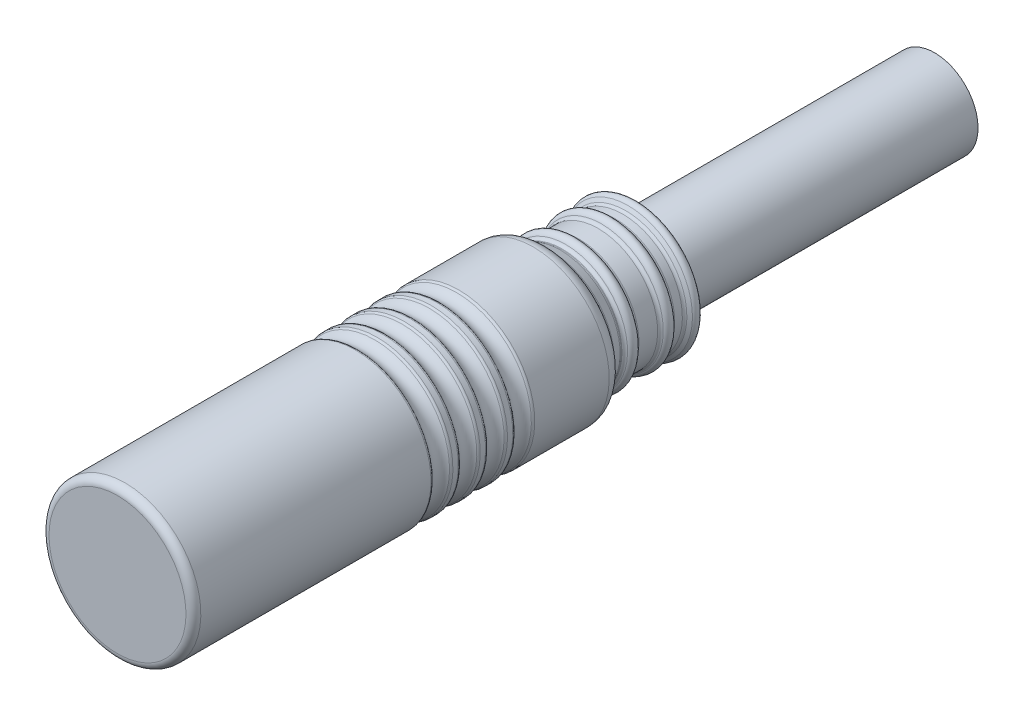
ISO-10303-21;
HEADER;
FILE_DESCRIPTION(('STEP AP214'),'2;1');
FILE_NAME('part.step','',(''),(''),'','','');
FILE_SCHEMA(('AUTOMOTIVE_DESIGN { 1 0 10303 214 1 1 1 1 }'));
ENDSEC;
DATA;
#1=APPLICATION_CONTEXT('core data for automotive mechanical design processes');
#2=APPLICATION_PROTOCOL_DEFINITION('international standard','automotive_design',2000,#1);
#3=PRODUCT_CONTEXT('',#1,'mechanical');
#4=PRODUCT('Part','Part','',(#3));
#5=PRODUCT_RELATED_PRODUCT_CATEGORY('part','',(#4));
#6=PRODUCT_DEFINITION_FORMATION('','',#4);
#7=PRODUCT_DEFINITION_CONTEXT('part definition',#1,'design');
#8=PRODUCT_DEFINITION('design','',#6,#7);
#9=PRODUCT_DEFINITION_SHAPE('','',#8);
#10=(LENGTH_UNIT() NAMED_UNIT(*) SI_UNIT(.MILLI.,.METRE.));
#11=(NAMED_UNIT(*) PLANE_ANGLE_UNIT() SI_UNIT($,.RADIAN.));
#12=(NAMED_UNIT(*) SI_UNIT($,.STERADIAN.) SOLID_ANGLE_UNIT());
#13=UNCERTAINTY_MEASURE_WITH_UNIT(LENGTH_MEASURE(1.E-05),#10,'distance_accuracy_value','');
#14=(GEOMETRIC_REPRESENTATION_CONTEXT(3) GLOBAL_UNCERTAINTY_ASSIGNED_CONTEXT((#13)) GLOBAL_UNIT_ASSIGNED_CONTEXT((#10,
#11,#12)) REPRESENTATION_CONTEXT('',''));
#15=CARTESIAN_POINT('',(0.,0.,0.));
#16=DIRECTION('',(0.,0.,1.));
#17=DIRECTION('',(1.,0.,0.));
#18=AXIS2_PLACEMENT_3D('',#15,#16,#17);
#19=CARTESIAN_POINT('',(0.,0.,-34.9));
#20=DIRECTION('',(0.,0.,-1.));
#21=DIRECTION('',(0.,1.,0.));
#22=AXIS2_PLACEMENT_3D('',#19,#20,#21);
#23=CYLINDRICAL_SURFACE('',#22,5.1);
#24=CARTESIAN_POINT('',(0.,0.,-17.7967873402005));
#25=DIRECTION('',(0.,0.,-1.));
#26=DIRECTION('',(0.,1.,0.));
#27=AXIS2_PLACEMENT_3D('',#24,#25,#26);
#28=CIRCLE('',#27,5.1);
#29=CARTESIAN_POINT('',(0.,5.1,-17.7967873402005));
#30=VERTEX_POINT('',#29);
#31=EDGE_CURVE('E149',#30,#30,#28,.T.);
#32=ORIENTED_EDGE('',*,*,#31,.F.);
#33=EDGE_LOOP('',(#32));
#34=FACE_BOUND('',#33,.T.);
#35=CARTESIAN_POINT('',(0.,0.,-17.4365459931328));
#36=DIRECTION('',(0.,0.,-1.));
#37=DIRECTION('',(0.,1.,0.));
#38=AXIS2_PLACEMENT_3D('',#35,#36,#37);
#39=CIRCLE('',#38,5.1);
#40=CARTESIAN_POINT('',(0.,5.1,-17.4365459931328));
#41=VERTEX_POINT('',#40);
#42=EDGE_CURVE('E40',#41,#41,#39,.T.);
#43=ORIENTED_EDGE('',*,*,#42,.T.);
#44=EDGE_LOOP('',(#43));
#45=FACE_BOUND('',#44,.T.);
#46=ADVANCED_FACE('F33',(#34,#45),#23,.T.);
#47=CARTESIAN_POINT('',(0.,0.,-17.4365459931328));
#48=DIRECTION('',(0.,0.,-1.));
#49=DIRECTION('',(0.,1.,0.));
#50=AXIS2_PLACEMENT_3D('',#47,#48,#49);
#51=TOROIDAL_SURFACE('',#50,4.89999999999996,0.199999999999999);
#52=CARTESIAN_POINT('',(0.,0.,-17.2814836787891));
#53=DIRECTION('',(0.,0.,-1.));
#54=DIRECTION('',(0.,1.,0.));
#55=AXIS2_PLACEMENT_3D('',#52,#53,#54);
#56=CIRCLE('',#55,5.02631578947364);
#57=CARTESIAN_POINT('',(0.,5.02631578947364,-17.2814836787891));
#58=VERTEX_POINT('',#57);
#59=EDGE_CURVE('E44',#58,#58,#56,.T.);
#60=ORIENTED_EDGE('',*,*,#59,.T.);
#61=EDGE_LOOP('',(#60));
#62=FACE_BOUND('',#61,.T.);
#63=ORIENTED_EDGE('',*,*,#42,.F.);
#64=EDGE_LOOP('',(#63));
#65=FACE_BOUND('',#64,.T.);
#66=ADVANCED_FACE('F35',(#62,#65),#51,.T.);
#67=CARTESIAN_POINT('',(0.,0.,-16.7));
#68=DIRECTION('',(0.,0.,-1.));
#69=DIRECTION('',(0.,1.,0.));
#70=AXIS2_PLACEMENT_3D('',#67,#68,#69);
#71=TOROIDAL_SURFACE('',#70,5.49999999999996,0.75);
#72=ORIENTED_EDGE('',*,*,#59,.F.);
#73=EDGE_LOOP('',(#72));
#74=FACE_BOUND('',#73,.T.);
#75=CARTESIAN_POINT('',(0.,0.,-16.1185163212109));
#76=DIRECTION('',(0.,0.,-1.));
#77=DIRECTION('',(0.,1.,0.));
#78=AXIS2_PLACEMENT_3D('',#75,#76,#77);
#79=CIRCLE('',#78,5.02631578947365);
#80=CARTESIAN_POINT('',(0.,5.02631578947364,-16.1185163212109));
#81=VERTEX_POINT('',#80);
#82=EDGE_CURVE('E48',#81,#81,#79,.T.);
#83=ORIENTED_EDGE('',*,*,#82,.T.);
#84=EDGE_LOOP('',(#83));
#85=FACE_BOUND('',#84,.T.);
#86=ADVANCED_FACE('F178',(#74,#85),#71,.F.);
#87=CARTESIAN_POINT('',(0.,0.,-15.9634540068672));
#88=DIRECTION('',(0.,0.,-1.));
#89=DIRECTION('',(0.,1.,0.));
#90=AXIS2_PLACEMENT_3D('',#87,#88,#89);
#91=TOROIDAL_SURFACE('',#90,4.89999999999996,0.199999999999999);
#92=CARTESIAN_POINT('',(0.,0.,-15.9634540068672));
#93=DIRECTION('',(0.,0.,-1.));
#94=DIRECTION('',(0.,1.,0.));
#95=AXIS2_PLACEMENT_3D('',#92,#93,#94);
#96=CIRCLE('',#95,5.1);
#97=CARTESIAN_POINT('',(0.,5.1,-15.9634540068672));
#98=VERTEX_POINT('',#97);
#99=EDGE_CURVE('E53',#98,#98,#96,.T.);
#100=ORIENTED_EDGE('',*,*,#99,.T.);
#101=EDGE_LOOP('',(#100));
#102=FACE_BOUND('',#101,.T.);
#103=ORIENTED_EDGE('',*,*,#82,.F.);
#104=EDGE_LOOP('',(#103));
#105=FACE_BOUND('',#104,.T.);
#106=ADVANCED_FACE('F185',(#102,#105),#91,.T.);
#107=ORIENTED_EDGE('',*,*,#99,.F.);
#108=EDGE_LOOP('',(#107));
#109=FACE_BOUND('',#108,.T.);
#110=CARTESIAN_POINT('',(0.,0.,-0.5));
#111=DIRECTION('',(0.,0.,-1.));
#112=DIRECTION('',(0.,1.,0.));
#113=AXIS2_PLACEMENT_3D('',#110,#111,#112);
#114=CIRCLE('',#113,5.1);
#115=CARTESIAN_POINT('',(0.,5.1,-0.500000000000001));
#116=VERTEX_POINT('',#115);
#117=EDGE_CURVE('E56',#116,#116,#114,.T.);
#118=ORIENTED_EDGE('',*,*,#117,.T.);
#119=EDGE_LOOP('',(#118));
#120=FACE_BOUND('',#119,.T.);
#121=ADVANCED_FACE('F173',(#109,#120),#23,.T.);
#122=CARTESIAN_POINT('',(0.,0.,-0.5));
#123=DIRECTION('',(0.,0.,-1.));
#124=DIRECTION('',(0.,1.,0.));
#125=AXIS2_PLACEMENT_3D('',#122,#123,#124);
#126=TOROIDAL_SURFACE('',#125,4.6,0.5);
#127=ORIENTED_EDGE('',*,*,#117,.F.);
#128=EDGE_LOOP('',(#127));
#129=FACE_BOUND('',#128,.T.);
#130=CARTESIAN_POINT('',(0.,0.,0.));
#131=DIRECTION('',(0.,0.,-1.));
#132=DIRECTION('',(0.,1.,0.));
#133=AXIS2_PLACEMENT_3D('',#130,#131,#132);
#134=CIRCLE('',#133,4.6);
#135=CARTESIAN_POINT('',(0.,4.6,0.));
#136=VERTEX_POINT('',#135);
#137=EDGE_CURVE('E59',#136,#136,#134,.T.);
#138=ORIENTED_EDGE('',*,*,#137,.T.);
#139=EDGE_LOOP('',(#138));
#140=FACE_BOUND('',#139,.T.);
#141=ADVANCED_FACE('F184',(#129,#140),#126,.T.);
#142=CARTESIAN_POINT('',(0.,0.,0.));
#143=DIRECTION('',(0.,0.,-1.));
#144=DIRECTION('',(0.,1.,0.));
#145=AXIS2_PLACEMENT_3D('',#142,#143,#144);
#146=PLANE('',#145);
#147=ORIENTED_EDGE('',*,*,#137,.F.);
#148=EDGE_LOOP('',(#147));
#149=FACE_BOUND('',#148,.T.);
#150=ADVANCED_FACE('F306',(#149),#146,.F.);
#151=CARTESIAN_POINT('',(0.,0.,-34.9));
#152=DIRECTION('',(0.,0.,1.));
#153=DIRECTION('',(0.,-1.,0.));
#154=AXIS2_PLACEMENT_3D('',#151,#152,#153);
#155=PLANE('',#154);
#156=CARTESIAN_POINT('',(0.,0.,-34.9));
#157=DIRECTION('',(0.,0.,1.));
#158=DIRECTION('',(0.,-1.,0.));
#159=AXIS2_PLACEMENT_3D('',#156,#157,#158);
#160=CIRCLE('',#159,2.92);
#161=CARTESIAN_POINT('',(0.,-2.92,-34.9));
#162=VERTEX_POINT('',#161);
#163=EDGE_CURVE('E10',#162,#162,#160,.F.);
#164=ORIENTED_EDGE('',*,*,#163,.F.);
#165=EDGE_LOOP('',(#164));
#166=FACE_BOUND('',#165,.T.);
#167=CARTESIAN_POINT('',(0.,0.,-34.9));
#168=DIRECTION('',(0.,0.,-1.));
#169=DIRECTION('',(0.,1.,0.));
#170=AXIS2_PLACEMENT_3D('',#167,#168,#169);
#171=CIRCLE('',#170,4.125);
#172=CARTESIAN_POINT('',(0.,4.125,-34.9));
#173=VERTEX_POINT('',#172);
#174=EDGE_CURVE('E62',#173,#173,#171,.T.);
#175=ORIENTED_EDGE('',*,*,#174,.T.);
#176=EDGE_LOOP('',(#175));
#177=FACE_BOUND('',#176,.T.);
#178=ADVANCED_FACE('F302',(#166,#177),#155,.F.);
#179=CARTESIAN_POINT('',(0.,0.,-34.575));
#180=DIRECTION('',(0.,0.,-1.));
#181=DIRECTION('',(0.,1.,0.));
#182=AXIS2_PLACEMENT_3D('',#179,#180,#181);
#183=TOROIDAL_SURFACE('',#182,4.125,0.325000000000005);
#184=ORIENTED_EDGE('',*,*,#174,.F.);
#185=EDGE_LOOP('',(#184));
#186=FACE_BOUND('',#185,.T.);
#187=CARTESIAN_POINT('',(0.,0.,-34.3129963528466));
#188=DIRECTION('',(0.,0.,-1.));
#189=DIRECTION('',(0.,1.,0.));
#190=AXIS2_PLACEMENT_3D('',#187,#188,#189);
#191=CIRCLE('',#190,4.31729947706198);
#192=CARTESIAN_POINT('',(0.,4.31729947706198,-34.3129963528466));
#193=VERTEX_POINT('',#192);
#194=EDGE_CURVE('E65',#193,#193,#191,.T.);
#195=ORIENTED_EDGE('',*,*,#194,.T.);
#196=EDGE_LOOP('',(#195));
#197=FACE_BOUND('',#196,.T.);
#198=ADVANCED_FACE('F298',(#186,#197),#183,.T.);
#199=CARTESIAN_POINT('',(0.,0.,-34.1550324936464));
#200=DIRECTION('',(0.,0.,-1.));
#201=DIRECTION('',(0.,1.,0.));
#202=AXIS2_PLACEMENT_3D('',#199,#200,#201);
#203=CONICAL_SURFACE('',#202,4.10207732533694,0.937641884585329);
#204=ORIENTED_EDGE('',*,*,#194,.F.);
#205=EDGE_LOOP('',(#204));
#206=FACE_BOUND('',#205,.T.);
#207=CARTESIAN_POINT('',(0.,0.,-34.1550324936464));
#208=DIRECTION('',(0.,0.,-1.));
#209=DIRECTION('',(0.,1.,0.));
#210=AXIS2_PLACEMENT_3D('',#207,#208,#209);
#211=CIRCLE('',#210,4.10207732533694);
#212=CARTESIAN_POINT('',(0.,4.10207732533694,-34.1550324936464));
#213=VERTEX_POINT('',#212);
#214=EDGE_CURVE('E68',#213,#213,#211,.T.);
#215=ORIENTED_EDGE('',*,*,#214,.T.);
#216=EDGE_LOOP('',(#215));
#217=FACE_BOUND('',#216,.T.);
#218=ADVANCED_FACE('F294',(#206,#217),#203,.T.);
#219=CARTESIAN_POINT('',(0.,0.,-33.9534912266053));
#220=DIRECTION('',(0.,0.,-1.));
#221=DIRECTION('',(0.,1.,0.));
#222=AXIS2_PLACEMENT_3D('',#219,#220,#221);
#223=TOROIDAL_SURFACE('',#222,4.25,0.250000000000006);
#224=ORIENTED_EDGE('',*,*,#214,.F.);
#225=EDGE_LOOP('',(#224));
#226=FACE_BOUND('',#225,.T.);
#227=CARTESIAN_POINT('',(0.,0.,-33.9534912266053));
#228=DIRECTION('',(0.,0.,-1.));
#229=DIRECTION('',(0.,1.,0.));
#230=AXIS2_PLACEMENT_3D('',#227,#228,#229);
#231=CIRCLE('',#230,4.);
#232=CARTESIAN_POINT('',(0.,4.,-33.9534912266053));
#233=VERTEX_POINT('',#232);
#234=EDGE_CURVE('E71',#233,#233,#231,.T.);
#235=ORIENTED_EDGE('',*,*,#234,.T.);
#236=EDGE_LOOP('',(#235));
#237=FACE_BOUND('',#236,.T.);
#238=ADVANCED_FACE('F290',(#226,#237),#223,.F.);
#239=CARTESIAN_POINT('',(0.,0.,-34.9));
#240=DIRECTION('',(0.,0.,-1.));
#241=DIRECTION('',(0.,1.,0.));
#242=AXIS2_PLACEMENT_3D('',#239,#240,#241);
#243=CYLINDRICAL_SURFACE('',#242,4.);
#244=ORIENTED_EDGE('',*,*,#234,.F.);
#245=EDGE_LOOP('',(#244));
#246=FACE_BOUND('',#245,.T.);
#247=CARTESIAN_POINT('',(0.,0.,-33.4379769299761));
#248=DIRECTION('',(0.,0.,-1.));
#249=DIRECTION('',(0.,1.,0.));
#250=AXIS2_PLACEMENT_3D('',#247,#248,#249);
#251=CIRCLE('',#250,4.);
#252=CARTESIAN_POINT('',(0.,4.,-33.4379769299761));
#253=VERTEX_POINT('',#252);
#254=EDGE_CURVE('E74',#253,#253,#251,.T.);
#255=ORIENTED_EDGE('',*,*,#254,.T.);
#256=EDGE_LOOP('',(#255));
#257=FACE_BOUND('',#256,.T.);
#258=ADVANCED_FACE('F286',(#246,#257),#243,.T.);
#259=CARTESIAN_POINT('',(0.,0.,-33.4379769299761));
#260=DIRECTION('',(0.,0.,-1.));
#261=DIRECTION('',(0.,1.,0.));
#262=AXIS2_PLACEMENT_3D('',#259,#260,#261);
#263=TOROIDAL_SURFACE('',#262,4.25,0.250000000000002);
#264=ORIENTED_EDGE('',*,*,#254,.F.);
#265=EDGE_LOOP('',(#264));
#266=FACE_BOUND('',#265,.T.);
#267=CARTESIAN_POINT('',(0.,0.,-33.2088481452283));
#268=DIRECTION('',(0.,0.,-1.));
#269=DIRECTION('',(0.,1.,0.));
#270=AXIS2_PLACEMENT_3D('',#267,#268,#269);
#271=CIRCLE('',#270,4.15);
#272=CARTESIAN_POINT('',(0.,4.15,-33.2088481452283));
#273=VERTEX_POINT('',#272);
#274=EDGE_CURVE('E77',#273,#273,#271,.T.);
#275=ORIENTED_EDGE('',*,*,#274,.T.);
#276=EDGE_LOOP('',(#275));
#277=FACE_BOUND('',#276,.T.);
#278=ADVANCED_FACE('F282',(#266,#277),#263,.F.);
#279=CARTESIAN_POINT('',(0.,0.,-32.8651549681066));
#280=DIRECTION('',(0.,0.,-1.));
#281=DIRECTION('',(0.,1.,0.));
#282=AXIS2_PLACEMENT_3D('',#279,#280,#281);
#283=TOROIDAL_SURFACE('',#282,4.,0.375);
#284=CARTESIAN_POINT('',(0.,0.,-32.5214617909849));
#285=DIRECTION('',(0.,0.,-1.));
#286=DIRECTION('',(0.,1.,0.));
#287=AXIS2_PLACEMENT_3D('',#284,#285,#286);
#288=CIRCLE('',#287,4.15);
#289=CARTESIAN_POINT('',(0.,4.15,-32.5214617909849));
#290=VERTEX_POINT('',#289);
#291=EDGE_CURVE('E80',#290,#290,#288,.T.);
#292=ORIENTED_EDGE('',*,*,#291,.T.);
#293=EDGE_LOOP('',(#292));
#294=FACE_BOUND('',#293,.T.);
#295=ORIENTED_EDGE('',*,*,#274,.F.);
#296=EDGE_LOOP('',(#295));
#297=FACE_BOUND('',#296,.T.);
#298=ADVANCED_FACE('F278',(#294,#297),#283,.T.);
#299=CARTESIAN_POINT('',(0.,0.,-32.2923330062371));
#300=DIRECTION('',(0.,0.,-1.));
#301=DIRECTION('',(0.,1.,0.));
#302=AXIS2_PLACEMENT_3D('',#299,#300,#301);
#303=TOROIDAL_SURFACE('',#302,4.25,0.249999999999999);
#304=CARTESIAN_POINT('',(0.,0.,-32.2923330062371));
#305=DIRECTION('',(0.,0.,-1.));
#306=DIRECTION('',(0.,1.,0.));
#307=AXIS2_PLACEMENT_3D('',#304,#305,#306);
#308=CIRCLE('',#307,4.);
#309=CARTESIAN_POINT('',(0.,4.,-32.2923330062371));
#310=VERTEX_POINT('',#309);
#311=EDGE_CURVE('E83',#310,#310,#308,.T.);
#312=ORIENTED_EDGE('',*,*,#311,.T.);
#313=EDGE_LOOP('',(#312));
#314=FACE_BOUND('',#313,.T.);
#315=ORIENTED_EDGE('',*,*,#291,.F.);
#316=EDGE_LOOP('',(#315));
#317=FACE_BOUND('',#316,.T.);
#318=ADVANCED_FACE('F274',(#314,#317),#303,.F.);
#319=CARTESIAN_POINT('',(0.,0.,-34.9));
#320=DIRECTION('',(0.,0.,-1.));
#321=DIRECTION('',(0.,1.,0.));
#322=AXIS2_PLACEMENT_3D('',#319,#320,#321);
#323=CYLINDRICAL_SURFACE('',#322,4.);
#324=ORIENTED_EDGE('',*,*,#311,.F.);
#325=EDGE_LOOP('',(#324));
#326=FACE_BOUND('',#325,.T.);
#327=CARTESIAN_POINT('',(0.,0.,-31.0379769299761));
#328=DIRECTION('',(0.,0.,-1.));
#329=DIRECTION('',(0.,1.,0.));
#330=AXIS2_PLACEMENT_3D('',#327,#328,#329);
#331=CIRCLE('',#330,4.);
#332=CARTESIAN_POINT('',(0.,4.,-31.0379769299761));
#333=VERTEX_POINT('',#332);
#334=EDGE_CURVE('E86',#333,#333,#331,.T.);
#335=ORIENTED_EDGE('',*,*,#334,.T.);
#336=EDGE_LOOP('',(#335));
#337=FACE_BOUND('',#336,.T.);
#338=ADVANCED_FACE('F270',(#326,#337),#323,.T.);
#339=CARTESIAN_POINT('',(0.,0.,-31.0379769299761));
#340=DIRECTION('',(0.,0.,-1.));
#341=DIRECTION('',(0.,1.,0.));
#342=AXIS2_PLACEMENT_3D('',#339,#340,#341);
#343=TOROIDAL_SURFACE('',#342,4.25,0.250000000000002);
#344=ORIENTED_EDGE('',*,*,#334,.F.);
#345=EDGE_LOOP('',(#344));
#346=FACE_BOUND('',#345,.T.);
#347=CARTESIAN_POINT('',(0.,0.,-30.8088481452283));
#348=DIRECTION('',(0.,0.,-1.));
#349=DIRECTION('',(0.,1.,0.));
#350=AXIS2_PLACEMENT_3D('',#347,#348,#349);
#351=CIRCLE('',#350,4.15);
#352=CARTESIAN_POINT('',(0.,4.15,-30.8088481452283));
#353=VERTEX_POINT('',#352);
#354=EDGE_CURVE('E89',#353,#353,#351,.T.);
#355=ORIENTED_EDGE('',*,*,#354,.T.);
#356=EDGE_LOOP('',(#355));
#357=FACE_BOUND('',#356,.T.);
#358=ADVANCED_FACE('F266',(#346,#357),#343,.F.);
#359=CARTESIAN_POINT('',(0.,0.,-30.4651549681066));
#360=DIRECTION('',(0.,0.,-1.));
#361=DIRECTION('',(0.,1.,0.));
#362=AXIS2_PLACEMENT_3D('',#359,#360,#361);
#363=TOROIDAL_SURFACE('',#362,4.,0.375);
#364=CARTESIAN_POINT('',(0.,0.,-30.1214617909849));
#365=DIRECTION('',(0.,0.,-1.));
#366=DIRECTION('',(0.,1.,0.));
#367=AXIS2_PLACEMENT_3D('',#364,#365,#366);
#368=CIRCLE('',#367,4.15);
#369=CARTESIAN_POINT('',(0.,4.15,-30.1214617909849));
#370=VERTEX_POINT('',#369);
#371=EDGE_CURVE('E92',#370,#370,#368,.T.);
#372=ORIENTED_EDGE('',*,*,#371,.T.);
#373=EDGE_LOOP('',(#372));
#374=FACE_BOUND('',#373,.T.);
#375=ORIENTED_EDGE('',*,*,#354,.F.);
#376=EDGE_LOOP('',(#375));
#377=FACE_BOUND('',#376,.T.);
#378=ADVANCED_FACE('F262',(#374,#377),#363,.T.);
#379=CARTESIAN_POINT('',(0.,0.,-29.8923330062371));
#380=DIRECTION('',(0.,0.,-1.));
#381=DIRECTION('',(0.,1.,0.));
#382=AXIS2_PLACEMENT_3D('',#379,#380,#381);
#383=TOROIDAL_SURFACE('',#382,4.25,0.249999999999999);
#384=CARTESIAN_POINT('',(0.,0.,-29.8923330062371));
#385=DIRECTION('',(0.,0.,-1.));
#386=DIRECTION('',(0.,1.,0.));
#387=AXIS2_PLACEMENT_3D('',#384,#385,#386);
#388=CIRCLE('',#387,4.);
#389=CARTESIAN_POINT('',(0.,4.,-29.8923330062371));
#390=VERTEX_POINT('',#389);
#391=EDGE_CURVE('E95',#390,#390,#388,.T.);
#392=ORIENTED_EDGE('',*,*,#391,.T.);
#393=EDGE_LOOP('',(#392));
#394=FACE_BOUND('',#393,.T.);
#395=ORIENTED_EDGE('',*,*,#371,.F.);
#396=EDGE_LOOP('',(#395));
#397=FACE_BOUND('',#396,.T.);
#398=ADVANCED_FACE('F258',(#394,#397),#383,.F.);
#399=CARTESIAN_POINT('',(0.,0.,-34.9));
#400=DIRECTION('',(0.,0.,-1.));
#401=DIRECTION('',(0.,1.,0.));
#402=AXIS2_PLACEMENT_3D('',#399,#400,#401);
#403=CYLINDRICAL_SURFACE('',#402,4.);
#404=ORIENTED_EDGE('',*,*,#391,.F.);
#405=EDGE_LOOP('',(#404));
#406=FACE_BOUND('',#405,.T.);
#407=CARTESIAN_POINT('',(0.,0.,-29.8423330062371));
#408=DIRECTION('',(0.,0.,-1.));
#409=DIRECTION('',(0.,1.,0.));
#410=AXIS2_PLACEMENT_3D('',#407,#408,#409);
#411=CIRCLE('',#410,4.);
#412=CARTESIAN_POINT('',(0.,4.,-29.8423330062371));
#413=VERTEX_POINT('',#412);
#414=EDGE_CURVE('E98',#413,#413,#411,.T.);
#415=ORIENTED_EDGE('',*,*,#414,.T.);
#416=EDGE_LOOP('',(#415));
#417=FACE_BOUND('',#416,.T.);
#418=ADVANCED_FACE('F254',(#406,#417),#403,.T.);
#419=CARTESIAN_POINT('',(0.,0.,-29.8423330062371));
#420=DIRECTION('',(0.,0.,-1.));
#421=DIRECTION('',(0.,1.,0.));
#422=AXIS2_PLACEMENT_3D('',#419,#420,#421);
#423=TOROIDAL_SURFACE('',#422,4.25,0.25);
#424=ORIENTED_EDGE('',*,*,#414,.F.);
#425=EDGE_LOOP('',(#424));
#426=FACE_BOUND('',#425,.T.);
#427=CARTESIAN_POINT('',(0.,0.,-29.7532210301054));
#428=DIRECTION('',(0.,0.,-1.));
#429=DIRECTION('',(0.,1.,0.));
#430=AXIS2_PLACEMENT_3D('',#427,#428,#429);
#431=CIRCLE('',#430,4.01642120021307);
#432=CARTESIAN_POINT('',(0.,4.01642120021306,-29.7532210301054));
#433=VERTEX_POINT('',#432);
#434=EDGE_CURVE('E101',#433,#433,#431,.T.);
#435=ORIENTED_EDGE('',*,*,#434,.T.);
#436=EDGE_LOOP('',(#435));
#437=FACE_BOUND('',#436,.T.);
#438=ADVANCED_FACE('F250',(#426,#437),#423,.F.);
#439=CARTESIAN_POINT('',(0.,0.,-29.1409682434623));
#440=DIRECTION('',(0.,0.,1.));
#441=DIRECTION('',(0.,-1.,0.));
#442=AXIS2_PLACEMENT_3D('',#439,#440,#441);
#443=CONICAL_SURFACE('',#442,4.25,0.364463306055192);
#444=ORIENTED_EDGE('',*,*,#434,.F.);
#445=EDGE_LOOP('',(#444));
#446=FACE_BOUND('',#445,.T.);
#447=CARTESIAN_POINT('',(0.,0.,-29.1409682434623));
#448=DIRECTION('',(0.,0.,-1.));
#449=DIRECTION('',(0.,1.,0.));
#450=AXIS2_PLACEMENT_3D('',#447,#448,#449);
#451=CIRCLE('',#450,4.25);
#452=CARTESIAN_POINT('',(0.,4.25,-29.1409682434623));
#453=VERTEX_POINT('',#452);
#454=EDGE_CURVE('E104',#453,#453,#451,.T.);
#455=ORIENTED_EDGE('',*,*,#454,.T.);
#456=EDGE_LOOP('',(#455));
#457=FACE_BOUND('',#456,.T.);
#458=ADVANCED_FACE('F246',(#446,#457),#443,.T.);
#459=CARTESIAN_POINT('',(0.,0.,-29.3191921957256));
#460=DIRECTION('',(0.,0.,-1.));
#461=DIRECTION('',(0.,1.,0.));
#462=AXIS2_PLACEMENT_3D('',#459,#460,#461);
#463=TOROIDAL_SURFACE('',#462,4.71715759957387,0.50000000000001);
#464=ORIENTED_EDGE('',*,*,#454,.F.);
#465=EDGE_LOOP('',(#464));
#466=FACE_BOUND('',#465,.T.);
#467=CARTESIAN_POINT('',(0.,0.,-28.8923330062371));
#468=DIRECTION('',(0.,0.,-1.));
#469=DIRECTION('',(0.,1.,0.));
#470=AXIS2_PLACEMENT_3D('',#467,#468,#469);
#471=CIRCLE('',#470,4.45679010477236);
#472=CARTESIAN_POINT('',(0.,4.45679010477236,-28.8923330062371));
#473=VERTEX_POINT('',#472);
#474=EDGE_CURVE('E107',#473,#473,#471,.T.);
#475=ORIENTED_EDGE('',*,*,#474,.T.);
#476=EDGE_LOOP('',(#475));
#477=FACE_BOUND('',#476,.T.);
#478=ADVANCED_FACE('F238',(#466,#477),#463,.F.);
#479=CARTESIAN_POINT('',(0.,0.,-28.7923330062371));
#480=DIRECTION('',(0.,0.,1.));
#481=DIRECTION('',(0.,-1.,0.));
#482=AXIS2_PLACEMENT_3D('',#479,#480,#481);
#483=CONICAL_SURFACE('',#482,4.62073498960303,1.0230846744561);
#484=ORIENTED_EDGE('',*,*,#474,.F.);
#485=EDGE_LOOP('',(#484));
#486=FACE_BOUND('',#485,.T.);
#487=CARTESIAN_POINT('',(0.,0.,-28.7923330062371));
#488=DIRECTION('',(0.,0.,-1.));
#489=DIRECTION('',(0.,1.,0.));
#490=AXIS2_PLACEMENT_3D('',#487,#488,#489);
#491=CIRCLE('',#490,4.62073498960303);
#492=CARTESIAN_POINT('',(0.,4.62073498960303,-28.7923330062371));
#493=VERTEX_POINT('',#492);
#494=EDGE_CURVE('E110',#493,#493,#491,.T.);
#495=ORIENTED_EDGE('',*,*,#494,.T.);
#496=EDGE_LOOP('',(#495));
#497=FACE_BOUND('',#496,.T.);
#498=ADVANCED_FACE('F227',(#486,#497),#483,.T.);
#499=CARTESIAN_POINT('',(0.,0.,-27.9386146272601));
#500=DIRECTION('',(0.,0.,-1.));
#501=DIRECTION('',(0.,1.,0.));
#502=AXIS2_PLACEMENT_3D('',#499,#500,#501);
#503=TOROIDAL_SURFACE('',#502,4.1,1.00000000000002);
#504=ORIENTED_EDGE('',*,*,#494,.F.);
#505=EDGE_LOOP('',(#504));
#506=FACE_BOUND('',#505,.T.);
#507=CARTESIAN_POINT('',(0.,0.,-27.9386146272601));
#508=DIRECTION('',(0.,0.,-1.));
#509=DIRECTION('',(0.,1.,0.));
#510=AXIS2_PLACEMENT_3D('',#507,#508,#509);
#511=CIRCLE('',#510,5.1);
#512=CARTESIAN_POINT('',(0.,5.1,-27.9386146272601));
#513=VERTEX_POINT('',#512);
#514=EDGE_CURVE('E113',#513,#513,#511,.T.);
#515=ORIENTED_EDGE('',*,*,#514,.T.);
#516=EDGE_LOOP('',(#515));
#517=FACE_BOUND('',#516,.T.);
#518=ADVANCED_FACE('F219',(#506,#517),#503,.T.);
#519=ORIENTED_EDGE('',*,*,#514,.F.);
#520=EDGE_LOOP('',(#519));
#521=FACE_BOUND('',#520,.T.);
#522=CARTESIAN_POINT('',(0.,0.,-22.9365459931328));
#523=DIRECTION('',(0.,0.,-1.));
#524=DIRECTION('',(0.,1.,0.));
#525=AXIS2_PLACEMENT_3D('',#522,#523,#524);
#526=CIRCLE('',#525,5.1);
#527=CARTESIAN_POINT('',(0.,5.1,-22.9365459931328));
#528=VERTEX_POINT('',#527);
#529=EDGE_CURVE('E116',#528,#528,#526,.T.);
#530=ORIENTED_EDGE('',*,*,#529,.T.);
#531=EDGE_LOOP('',(#530));
#532=FACE_BOUND('',#531,.T.);
#533=ADVANCED_FACE('F187',(#521,#532),#23,.T.);
#534=CARTESIAN_POINT('',(0.,0.,-22.9365459931328));
#535=DIRECTION('',(0.,0.,-1.));
#536=DIRECTION('',(0.,1.,0.));
#537=AXIS2_PLACEMENT_3D('',#534,#535,#536);
#538=TOROIDAL_SURFACE('',#537,4.9,0.199999999999999);
#539=CARTESIAN_POINT('',(0.,0.,-22.7814836787891));
#540=DIRECTION('',(0.,0.,-1.));
#541=DIRECTION('',(0.,1.,0.));
#542=AXIS2_PLACEMENT_3D('',#539,#540,#541);
#543=CIRCLE('',#542,5.02631578947368);
#544=CARTESIAN_POINT('',(0.,5.02631578947368,-22.7814836787891));
#545=VERTEX_POINT('',#544);
#546=EDGE_CURVE('E119',#545,#545,#543,.T.);
#547=ORIENTED_EDGE('',*,*,#546,.T.);
#548=EDGE_LOOP('',(#547));
#549=FACE_BOUND('',#548,.T.);
#550=ORIENTED_EDGE('',*,*,#529,.F.);
#551=EDGE_LOOP('',(#550));
#552=FACE_BOUND('',#551,.T.);
#553=ADVANCED_FACE('F218',(#549,#552),#538,.T.);
#554=CARTESIAN_POINT('',(0.,0.,-22.2));
#555=DIRECTION('',(0.,0.,-1.));
#556=DIRECTION('',(0.,1.,0.));
#557=AXIS2_PLACEMENT_3D('',#554,#555,#556);
#558=TOROIDAL_SURFACE('',#557,5.5,0.75);
#559=ORIENTED_EDGE('',*,*,#546,.F.);
#560=EDGE_LOOP('',(#559));
#561=FACE_BOUND('',#560,.T.);
#562=CARTESIAN_POINT('',(0.,0.,-21.6185163212109));
#563=DIRECTION('',(0.,0.,-1.));
#564=DIRECTION('',(0.,1.,0.));
#565=AXIS2_PLACEMENT_3D('',#562,#563,#564);
#566=CIRCLE('',#565,5.02631578947368);
#567=CARTESIAN_POINT('',(0.,5.02631578947368,-21.6185163212109));
#568=VERTEX_POINT('',#567);
#569=EDGE_CURVE('E122',#568,#568,#566,.T.);
#570=ORIENTED_EDGE('',*,*,#569,.T.);
#571=EDGE_LOOP('',(#570));
#572=FACE_BOUND('',#571,.T.);
#573=ADVANCED_FACE('F212',(#561,#572),#558,.F.);
#574=CARTESIAN_POINT('',(0.,0.,-21.4634540068672));
#575=DIRECTION('',(0.,0.,-1.));
#576=DIRECTION('',(0.,1.,0.));
#577=AXIS2_PLACEMENT_3D('',#574,#575,#576);
#578=TOROIDAL_SURFACE('',#577,4.9,0.199999999999999);
#579=CARTESIAN_POINT('',(0.,0.,-21.4634540068672));
#580=DIRECTION('',(0.,0.,-1.));
#581=DIRECTION('',(0.,1.,0.));
#582=AXIS2_PLACEMENT_3D('',#579,#580,#581);
#583=CIRCLE('',#582,5.1);
#584=CARTESIAN_POINT('',(0.,5.1,-21.4634540068672));
#585=VERTEX_POINT('',#584);
#586=EDGE_CURVE('E125',#585,#585,#583,.T.);
#587=ORIENTED_EDGE('',*,*,#586,.T.);
#588=EDGE_LOOP('',(#587));
#589=FACE_BOUND('',#588,.T.);
#590=ORIENTED_EDGE('',*,*,#569,.F.);
#591=EDGE_LOOP('',(#590));
#592=FACE_BOUND('',#591,.T.);
#593=ADVANCED_FACE('F204',(#589,#592),#578,.T.);
#594=ORIENTED_EDGE('',*,*,#586,.F.);
#595=EDGE_LOOP('',(#594));
#596=FACE_BOUND('',#595,.T.);
#597=CARTESIAN_POINT('',(0.,0.,-21.1032126597995));
#598=DIRECTION('',(0.,0.,-1.));
#599=DIRECTION('',(0.,1.,0.));
#600=AXIS2_PLACEMENT_3D('',#597,#598,#599);
#601=CIRCLE('',#600,5.1);
#602=CARTESIAN_POINT('',(0.,5.1,-21.1032126597995));
#603=VERTEX_POINT('',#602);
#604=EDGE_CURVE('E128',#603,#603,#601,.T.);
#605=ORIENTED_EDGE('',*,*,#604,.T.);
#606=EDGE_LOOP('',(#605));
#607=FACE_BOUND('',#606,.T.);
#608=ADVANCED_FACE('F192',(#596,#607),#23,.T.);
#609=CARTESIAN_POINT('',(0.,0.,-21.1032126597995));
#610=DIRECTION('',(0.,0.,-1.));
#611=DIRECTION('',(0.,1.,0.));
#612=AXIS2_PLACEMENT_3D('',#609,#610,#611);
#613=TOROIDAL_SURFACE('',#612,4.89999999999999,0.199999999999999);
#614=CARTESIAN_POINT('',(0.,0.,-20.9481503454557));
#615=DIRECTION('',(0.,0.,-1.));
#616=DIRECTION('',(0.,1.,0.));
#617=AXIS2_PLACEMENT_3D('',#614,#615,#616);
#618=CIRCLE('',#617,5.02631578947367);
#619=CARTESIAN_POINT('',(0.,5.02631578947367,-20.9481503454557));
#620=VERTEX_POINT('',#619);
#621=EDGE_CURVE('E131',#620,#620,#618,.T.);
#622=ORIENTED_EDGE('',*,*,#621,.T.);
#623=EDGE_LOOP('',(#622));
#624=FACE_BOUND('',#623,.T.);
#625=ORIENTED_EDGE('',*,*,#604,.F.);
#626=EDGE_LOOP('',(#625));
#627=FACE_BOUND('',#626,.T.);
#628=ADVANCED_FACE('F203',(#624,#627),#613,.T.);
#629=CARTESIAN_POINT('',(0.,0.,-20.3666666666667));
#630=DIRECTION('',(0.,0.,-1.));
#631=DIRECTION('',(0.,1.,0.));
#632=AXIS2_PLACEMENT_3D('',#629,#630,#631);
#633=TOROIDAL_SURFACE('',#632,5.49999999999998,0.75);
#634=ORIENTED_EDGE('',*,*,#621,.F.);
#635=EDGE_LOOP('',(#634));
#636=FACE_BOUND('',#635,.T.);
#637=CARTESIAN_POINT('',(0.,0.,-19.7851829878776));
#638=DIRECTION('',(0.,0.,-1.));
#639=DIRECTION('',(0.,1.,0.));
#640=AXIS2_PLACEMENT_3D('',#637,#638,#639);
#641=CIRCLE('',#640,5.02631578947367);
#642=CARTESIAN_POINT('',(0.,5.02631578947367,-19.7851829878776));
#643=VERTEX_POINT('',#642);
#644=EDGE_CURVE('E134',#643,#643,#641,.T.);
#645=ORIENTED_EDGE('',*,*,#644,.T.);
#646=EDGE_LOOP('',(#645));
#647=FACE_BOUND('',#646,.T.);
#648=ADVANCED_FACE('F198',(#636,#647),#633,.F.);
#649=CARTESIAN_POINT('',(0.,0.,-19.6301206735339));
#650=DIRECTION('',(0.,0.,-1.));
#651=DIRECTION('',(0.,1.,0.));
#652=AXIS2_PLACEMENT_3D('',#649,#650,#651);
#653=TOROIDAL_SURFACE('',#652,4.89999999999999,0.199999999999999);
#654=CARTESIAN_POINT('',(0.,0.,-19.6301206735339));
#655=DIRECTION('',(0.,0.,-1.));
#656=DIRECTION('',(0.,1.,0.));
#657=AXIS2_PLACEMENT_3D('',#654,#655,#656);
#658=CIRCLE('',#657,5.1);
#659=CARTESIAN_POINT('',(0.,5.1,-19.6301206735339));
#660=VERTEX_POINT('',#659);
#661=EDGE_CURVE('E137',#660,#660,#658,.T.);
#662=ORIENTED_EDGE('',*,*,#661,.T.);
#663=EDGE_LOOP('',(#662));
#664=FACE_BOUND('',#663,.T.);
#665=ORIENTED_EDGE('',*,*,#644,.F.);
#666=EDGE_LOOP('',(#665));
#667=FACE_BOUND('',#666,.T.);
#668=ADVANCED_FACE('F190',(#664,#667),#653,.T.);
#669=ORIENTED_EDGE('',*,*,#661,.F.);
#670=EDGE_LOOP('',(#669));
#671=FACE_BOUND('',#670,.T.);
#672=CARTESIAN_POINT('',(0.,0.,-19.2698793264661));
#673=DIRECTION('',(0.,0.,-1.));
#674=DIRECTION('',(0.,1.,0.));
#675=AXIS2_PLACEMENT_3D('',#672,#673,#674);
#676=CIRCLE('',#675,5.1);
#677=CARTESIAN_POINT('',(0.,5.1,-19.2698793264661));
#678=VERTEX_POINT('',#677);
#679=EDGE_CURVE('E140',#678,#678,#676,.T.);
#680=ORIENTED_EDGE('',*,*,#679,.T.);
#681=EDGE_LOOP('',(#680));
#682=FACE_BOUND('',#681,.T.);
#683=ADVANCED_FACE('F174',(#671,#682),#23,.T.);
#684=CARTESIAN_POINT('',(0.,0.,-19.2698793264661));
#685=DIRECTION('',(0.,0.,-1.));
#686=DIRECTION('',(0.,1.,0.));
#687=AXIS2_PLACEMENT_3D('',#684,#685,#686);
#688=TOROIDAL_SURFACE('',#687,4.89999999999998,0.199999999999999);
#689=CARTESIAN_POINT('',(0.,0.,-19.1148170121224));
#690=DIRECTION('',(0.,0.,-1.));
#691=DIRECTION('',(0.,1.,0.));
#692=AXIS2_PLACEMENT_3D('',#689,#690,#691);
#693=CIRCLE('',#692,5.02631578947366);
#694=CARTESIAN_POINT('',(0.,5.02631578947366,-19.1148170121224));
#695=VERTEX_POINT('',#694);
#696=EDGE_CURVE('E143',#695,#695,#693,.T.);
#697=ORIENTED_EDGE('',*,*,#696,.T.);
#698=EDGE_LOOP('',(#697));
#699=FACE_BOUND('',#698,.T.);
#700=ORIENTED_EDGE('',*,*,#679,.F.);
#701=EDGE_LOOP('',(#700));
#702=FACE_BOUND('',#701,.T.);
#703=ADVANCED_FACE('F189',(#699,#702),#688,.T.);
#704=CARTESIAN_POINT('',(0.,0.,-18.5333333333333));
#705=DIRECTION('',(0.,0.,-1.));
#706=DIRECTION('',(0.,1.,0.));
#707=AXIS2_PLACEMENT_3D('',#704,#705,#706);
#708=TOROIDAL_SURFACE('',#707,5.49999999999997,0.75);
#709=ORIENTED_EDGE('',*,*,#696,.F.);
#710=EDGE_LOOP('',(#709));
#711=FACE_BOUND('',#710,.T.);
#712=CARTESIAN_POINT('',(0.,0.,-17.9518496545443));
#713=DIRECTION('',(0.,0.,-1.));
#714=DIRECTION('',(0.,1.,0.));
#715=AXIS2_PLACEMENT_3D('',#712,#713,#714);
#716=CIRCLE('',#715,5.02631578947366);
#717=CARTESIAN_POINT('',(0.,5.02631578947366,-17.9518496545443));
#718=VERTEX_POINT('',#717);
#719=EDGE_CURVE('E146',#718,#718,#716,.T.);
#720=ORIENTED_EDGE('',*,*,#719,.T.);
#721=EDGE_LOOP('',(#720));
#722=FACE_BOUND('',#721,.T.);
#723=ADVANCED_FACE('F167',(#711,#722),#708,.F.);
#724=CARTESIAN_POINT('',(0.,0.,-17.7967873402005));
#725=DIRECTION('',(0.,0.,-1.));
#726=DIRECTION('',(0.,1.,0.));
#727=AXIS2_PLACEMENT_3D('',#724,#725,#726);
#728=TOROIDAL_SURFACE('',#727,4.89999999999998,0.199999999999999);
#729=ORIENTED_EDGE('',*,*,#31,.T.);
#730=EDGE_LOOP('',(#729));
#731=FACE_BOUND('',#730,.T.);
#732=ORIENTED_EDGE('',*,*,#719,.F.);
#733=EDGE_LOOP('',(#732));
#734=FACE_BOUND('',#733,.T.);
#735=ADVANCED_FACE('F160',(#731,#734),#728,.T.);
#736=CARTESIAN_POINT('',(0.,0.,-54.9));
#737=DIRECTION('',(0.,0.,1.));
#738=DIRECTION('',(1.,0.,0.));
#739=AXIS2_PLACEMENT_3D('',#736,#737,#738);
#740=CYLINDRICAL_SURFACE('',#739,2.92);
#741=CARTESIAN_POINT('',(0.,0.,-54.9));
#742=DIRECTION('',(0.,0.,-1.));
#743=DIRECTION('',(-1.,0.,0.));
#744=AXIS2_PLACEMENT_3D('',#741,#742,#743);
#745=CIRCLE('',#744,2.92);
#746=CARTESIAN_POINT('',(-2.92,0.,-54.9));
#747=VERTEX_POINT('',#746);
#748=EDGE_CURVE('E152',#747,#747,#745,.T.);
#749=ORIENTED_EDGE('',*,*,#748,.F.);
#750=EDGE_LOOP('',(#749));
#751=FACE_BOUND('',#750,.T.);
#752=ORIENTED_EDGE('',*,*,#163,.T.);
#753=EDGE_LOOP('',(#752));
#754=FACE_BOUND('',#753,.T.);
#755=ADVANCED_FACE('F158',(#751,#754),#740,.T.);
#756=CARTESIAN_POINT('',(0.,0.,-54.9));
#757=DIRECTION('',(0.,0.,-1.));
#758=DIRECTION('',(-1.,0.,0.));
#759=AXIS2_PLACEMENT_3D('',#756,#757,#758);
#760=PLANE('',#759);
#761=ORIENTED_EDGE('',*,*,#748,.T.);
#762=EDGE_LOOP('',(#761));
#763=FACE_BOUND('',#762,.T.);
#764=ADVANCED_FACE('F156',(#763),#760,.T.);
#765=CLOSED_SHELL('',(#46,#66,#86,#106,#121,#141,#150,#178,#198,#218,#238,#258,#278,#298,#318,
#338,#358,#378,#398,#418,#438,#458,#478,#498,#518,#533,#553,#573,#593,#608,#628,#648,#668,#683,
#703,#723,#735,#755,#764));
#766=MANIFOLD_SOLID_BREP('B2',#765);
#767=ADVANCED_BREP_SHAPE_REPRESENTATION('',(#18,#766),#14);
#768=SHAPE_DEFINITION_REPRESENTATION(#9,#767);
ENDSEC;
END-ISO-10303-21;
